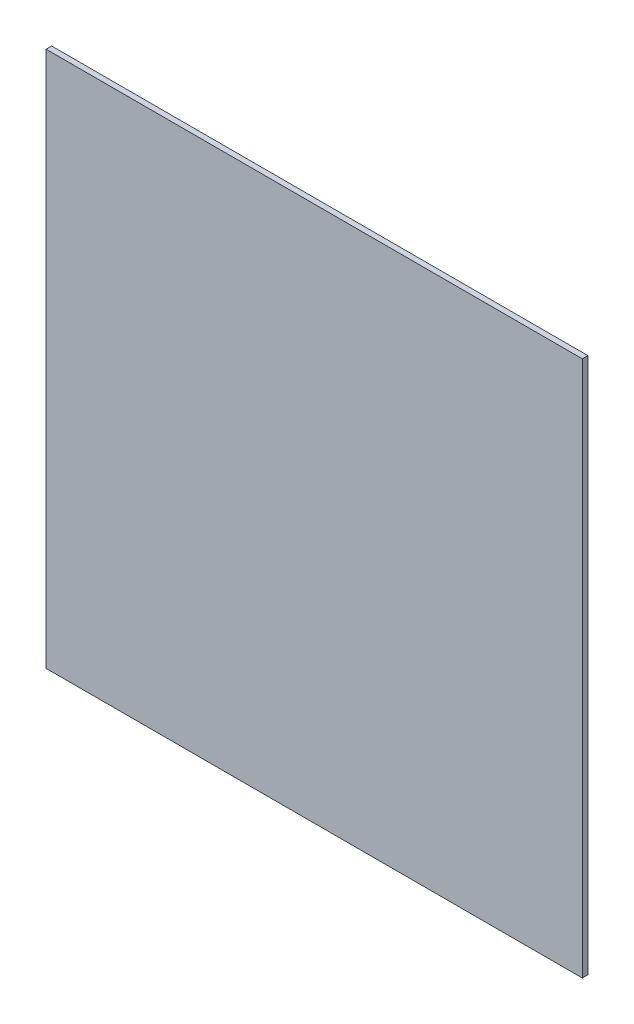
ISO-10303-21;
HEADER;
FILE_DESCRIPTION(('STEP AP214'),'2;1');
FILE_NAME('part.step','',(''),(''),'','','');
FILE_SCHEMA(('AUTOMOTIVE_DESIGN { 1 0 10303 214 1 1 1 1 }'));
ENDSEC;
DATA;
#1=APPLICATION_CONTEXT('core data for automotive mechanical design processes');
#2=APPLICATION_PROTOCOL_DEFINITION('international standard','automotive_design',2000,#1);
#3=PRODUCT_CONTEXT('',#1,'mechanical');
#4=PRODUCT('Part','Part','',(#3));
#5=PRODUCT_RELATED_PRODUCT_CATEGORY('part','',(#4));
#6=PRODUCT_DEFINITION_FORMATION('','',#4);
#7=PRODUCT_DEFINITION_CONTEXT('part definition',#1,'design');
#8=PRODUCT_DEFINITION('design','',#6,#7);
#9=PRODUCT_DEFINITION_SHAPE('','',#8);
#10=(LENGTH_UNIT() NAMED_UNIT(*) SI_UNIT(.MILLI.,.METRE.));
#11=(NAMED_UNIT(*) PLANE_ANGLE_UNIT() SI_UNIT($,.RADIAN.));
#12=(NAMED_UNIT(*) SI_UNIT($,.STERADIAN.) SOLID_ANGLE_UNIT());
#13=UNCERTAINTY_MEASURE_WITH_UNIT(LENGTH_MEASURE(1.E-05),#10,'distance_accuracy_value','');
#14=(GEOMETRIC_REPRESENTATION_CONTEXT(3) GLOBAL_UNCERTAINTY_ASSIGNED_CONTEXT((#13)) GLOBAL_UNIT_ASSIGNED_CONTEXT((#10,
#11,#12)) REPRESENTATION_CONTEXT('',''));
#15=CARTESIAN_POINT('',(0.,0.,0.));
#16=DIRECTION('',(0.,0.,1.));
#17=DIRECTION('',(1.,0.,0.));
#18=AXIS2_PLACEMENT_3D('',#15,#16,#17);
#19=CARTESIAN_POINT('',(0.,-5189.,9.525));
#20=DIRECTION('',(-1.,0.,0.));
#21=DIRECTION('',(0.,-1.,0.));
#22=AXIS2_PLACEMENT_3D('',#19,#20,#21);
#23=PLANE('',#22);
#24=DIRECTION('',(0.,1.,0.));
#25=VECTOR('',#24,1.);
#26=CARTESIAN_POINT('',(0.,-5189.,0.));
#27=LINE('',#26,#25);
#28=CARTESIAN_POINT('',(0.,-5189.,0.));
#29=VERTEX_POINT('',#28);
#30=CARTESIAN_POINT('',(0.,-4274.6,0.));
#31=VERTEX_POINT('',#30);
#32=EDGE_CURVE('E97',#29,#31,#27,.T.);
#33=ORIENTED_EDGE('',*,*,#32,.T.);
#34=DIRECTION('',(0.,0.,-1.));
#35=VECTOR('',#34,1.);
#36=CARTESIAN_POINT('',(0.,-4274.6,9.525));
#37=LINE('',#36,#35);
#38=CARTESIAN_POINT('',(0.,-4274.6,9.525));
#39=VERTEX_POINT('',#38);
#40=EDGE_CURVE('E11',#39,#31,#37,.T.);
#41=ORIENTED_EDGE('',*,*,#40,.F.);
#42=DIRECTION('',(0.,1.,0.));
#43=VECTOR('',#42,1.);
#44=CARTESIAN_POINT('',(0.,-5189.,9.525));
#45=LINE('',#44,#43);
#46=CARTESIAN_POINT('',(0.,-5189.,9.525));
#47=VERTEX_POINT('',#46);
#48=EDGE_CURVE('E85',#47,#39,#45,.T.);
#49=ORIENTED_EDGE('',*,*,#48,.F.);
#50=DIRECTION('',(0.,0.,-1.));
#51=VECTOR('',#50,1.);
#52=CARTESIAN_POINT('',(0.,-5189.,9.525));
#53=LINE('',#52,#51);
#54=EDGE_CURVE('E93',#47,#29,#53,.T.);
#55=ORIENTED_EDGE('',*,*,#54,.T.);
#56=EDGE_LOOP('',(#33,#41,#49,#55));
#57=FACE_BOUND('',#56,.T.);
#58=ADVANCED_FACE('F34',(#57),#23,.F.);
#59=CARTESIAN_POINT('',(0.,-4274.6,9.525));
#60=DIRECTION('',(0.,-1.,0.));
#61=DIRECTION('',(0.,0.,-1.));
#62=AXIS2_PLACEMENT_3D('',#59,#60,#61);
#63=PLANE('',#62);
#64=DIRECTION('',(-1.,0.,0.));
#65=VECTOR('',#64,1.);
#66=CARTESIAN_POINT('',(0.,-4274.6,0.));
#67=LINE('',#66,#65);
#68=CARTESIAN_POINT('',(-914.4,-4274.6,0.));
#69=VERTEX_POINT('',#68);
#70=EDGE_CURVE('E89',#31,#69,#67,.T.);
#71=ORIENTED_EDGE('',*,*,#70,.T.);
#72=DIRECTION('',(0.,0.,-1.));
#73=VECTOR('',#72,1.);
#74=CARTESIAN_POINT('',(-914.4,-4274.6,9.525));
#75=LINE('',#74,#73);
#76=CARTESIAN_POINT('',(-914.4,-4274.6,9.525));
#77=VERTEX_POINT('',#76);
#78=EDGE_CURVE('E42',#77,#69,#75,.T.);
#79=ORIENTED_EDGE('',*,*,#78,.F.);
#80=DIRECTION('',(-1.,0.,0.));
#81=VECTOR('',#80,1.);
#82=CARTESIAN_POINT('',(0.,-4274.6,9.525));
#83=LINE('',#82,#81);
#84=EDGE_CURVE('E80',#39,#77,#83,.T.);
#85=ORIENTED_EDGE('',*,*,#84,.F.);
#86=ORIENTED_EDGE('',*,*,#40,.T.);
#87=EDGE_LOOP('',(#71,#79,#85,#86));
#88=FACE_BOUND('',#87,.T.);
#89=ADVANCED_FACE('F88',(#88),#63,.F.);
#90=CARTESIAN_POINT('',(-914.4,-5189.,9.525));
#91=DIRECTION('',(1.,0.,0.));
#92=DIRECTION('',(0.,0.,-1.));
#93=AXIS2_PLACEMENT_3D('',#90,#91,#92);
#94=PLANE('',#93);
#95=DIRECTION('',(0.,-1.,0.));
#96=VECTOR('',#95,1.);
#97=CARTESIAN_POINT('',(-914.4,-5189.,0.));
#98=LINE('',#97,#96);
#99=CARTESIAN_POINT('',(-914.4,-5189.,0.));
#100=VERTEX_POINT('',#99);
#101=EDGE_CURVE('E67',#69,#100,#98,.T.);
#102=ORIENTED_EDGE('',*,*,#101,.T.);
#103=DIRECTION('',(0.,0.,-1.));
#104=VECTOR('',#103,1.);
#105=CARTESIAN_POINT('',(-914.4,-5189.,9.525));
#106=LINE('',#105,#104);
#107=CARTESIAN_POINT('',(-914.4,-5189.,9.525));
#108=VERTEX_POINT('',#107);
#109=EDGE_CURVE('E90',#108,#100,#106,.T.);
#110=ORIENTED_EDGE('',*,*,#109,.F.);
#111=DIRECTION('',(0.,-1.,0.));
#112=VECTOR('',#111,1.);
#113=CARTESIAN_POINT('',(-914.4,-5189.,9.525));
#114=LINE('',#113,#112);
#115=EDGE_CURVE('E83',#77,#108,#114,.T.);
#116=ORIENTED_EDGE('',*,*,#115,.F.);
#117=ORIENTED_EDGE('',*,*,#78,.T.);
#118=EDGE_LOOP('',(#102,#110,#116,#117));
#119=FACE_BOUND('',#118,.T.);
#120=ADVANCED_FACE('F91',(#119),#94,.F.);
#121=CARTESIAN_POINT('',(0.,-5189.,9.525));
#122=DIRECTION('',(0.,1.,0.));
#123=DIRECTION('',(0.,0.,1.));
#124=AXIS2_PLACEMENT_3D('',#121,#122,#123);
#125=PLANE('',#124);
#126=DIRECTION('',(1.,0.,0.));
#127=VECTOR('',#126,1.);
#128=CARTESIAN_POINT('',(0.,-5189.,0.));
#129=LINE('',#128,#127);
#130=EDGE_CURVE('E73',#100,#29,#129,.T.);
#131=ORIENTED_EDGE('',*,*,#130,.T.);
#132=ORIENTED_EDGE('',*,*,#54,.F.);
#133=DIRECTION('',(1.,0.,0.));
#134=VECTOR('',#133,1.);
#135=CARTESIAN_POINT('',(0.,-5189.,9.525));
#136=LINE('',#135,#134);
#137=EDGE_CURVE('E50',#108,#47,#136,.T.);
#138=ORIENTED_EDGE('',*,*,#137,.F.);
#139=ORIENTED_EDGE('',*,*,#109,.T.);
#140=EDGE_LOOP('',(#131,#132,#138,#139));
#141=FACE_BOUND('',#140,.T.);
#142=ADVANCED_FACE('F104',(#141),#125,.F.);
#143=CARTESIAN_POINT('',(0.,0.,9.525));
#144=DIRECTION('',(0.,0.,1.));
#145=DIRECTION('',(1.,0.,0.));
#146=AXIS2_PLACEMENT_3D('',#143,#144,#145);
#147=PLANE('',#146);
#148=ORIENTED_EDGE('',*,*,#48,.T.);
#149=ORIENTED_EDGE('',*,*,#84,.T.);
#150=ORIENTED_EDGE('',*,*,#115,.T.);
#151=ORIENTED_EDGE('',*,*,#137,.T.);
#152=EDGE_LOOP('',(#148,#149,#150,#151));
#153=FACE_BOUND('',#152,.T.);
#154=ADVANCED_FACE('F81',(#153),#147,.T.);
#155=CARTESIAN_POINT('',(0.,0.,0.));
#156=DIRECTION('',(0.,0.,1.));
#157=DIRECTION('',(1.,0.,0.));
#158=AXIS2_PLACEMENT_3D('',#155,#156,#157);
#159=PLANE('',#158);
#160=ORIENTED_EDGE('',*,*,#32,.F.);
#161=ORIENTED_EDGE('',*,*,#130,.F.);
#162=ORIENTED_EDGE('',*,*,#101,.F.);
#163=ORIENTED_EDGE('',*,*,#70,.F.);
#164=EDGE_LOOP('',(#160,#161,#162,#163));
#165=FACE_BOUND('',#164,.T.);
#166=ADVANCED_FACE('F107',(#165),#159,.F.);
#167=CLOSED_SHELL('',(#58,#89,#120,#142,#154,#166));
#168=MANIFOLD_SOLID_BREP('B2',#167);
#169=ADVANCED_BREP_SHAPE_REPRESENTATION('',(#18,#168),#14);
#170=SHAPE_DEFINITION_REPRESENTATION(#9,#169);
ENDSEC;
END-ISO-10303-21;
